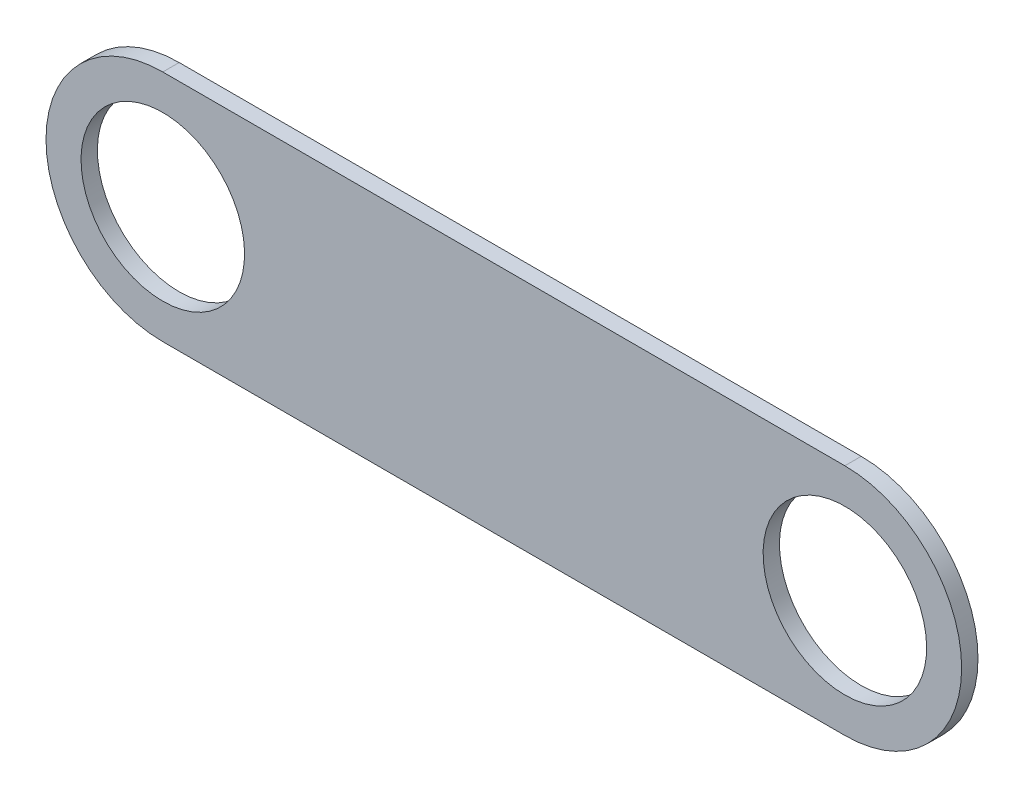
ISO-10303-21;
HEADER;
FILE_DESCRIPTION(('STEP AP214'),'2;1');
FILE_NAME('part.step','',(''),(''),'','','');
FILE_SCHEMA(('AUTOMOTIVE_DESIGN { 1 0 10303 214 1 1 1 1 }'));
ENDSEC;
DATA;
#1=APPLICATION_CONTEXT('core data for automotive mechanical design processes');
#2=APPLICATION_PROTOCOL_DEFINITION('international standard','automotive_design',2000,#1);
#3=PRODUCT_CONTEXT('',#1,'mechanical');
#4=PRODUCT('Part','Part','',(#3));
#5=PRODUCT_RELATED_PRODUCT_CATEGORY('part','',(#4));
#6=PRODUCT_DEFINITION_FORMATION('','',#4);
#7=PRODUCT_DEFINITION_CONTEXT('part definition',#1,'design');
#8=PRODUCT_DEFINITION('design','',#6,#7);
#9=PRODUCT_DEFINITION_SHAPE('','',#8);
#10=(LENGTH_UNIT() NAMED_UNIT(*) SI_UNIT(.MILLI.,.METRE.));
#11=(NAMED_UNIT(*) PLANE_ANGLE_UNIT() SI_UNIT($,.RADIAN.));
#12=(NAMED_UNIT(*) SI_UNIT($,.STERADIAN.) SOLID_ANGLE_UNIT());
#13=UNCERTAINTY_MEASURE_WITH_UNIT(LENGTH_MEASURE(1.E-05),#10,'distance_accuracy_value','');
#14=(GEOMETRIC_REPRESENTATION_CONTEXT(3) GLOBAL_UNCERTAINTY_ASSIGNED_CONTEXT((#13)) GLOBAL_UNIT_ASSIGNED_CONTEXT((#10,
#11,#12)) REPRESENTATION_CONTEXT('',''));
#15=CARTESIAN_POINT('',(0.,0.,0.));
#16=DIRECTION('',(0.,0.,1.));
#17=DIRECTION('',(1.,0.,0.));
#18=AXIS2_PLACEMENT_3D('',#15,#16,#17);
#19=CARTESIAN_POINT('',(117.72,-55.31,-0.045));
#20=DIRECTION('',(0.,0.,-1.));
#21=DIRECTION('',(0.,-1.,0.));
#22=AXIS2_PLACEMENT_3D('',#19,#20,#21);
#23=CYLINDRICAL_SURFACE('',#22,0.175);
#24=CARTESIAN_POINT('',(117.72,-55.31,-0.035));
#25=DIRECTION('',(0.,0.,-1.));
#26=DIRECTION('',(0.,-1.,0.));
#27=AXIS2_PLACEMENT_3D('',#24,#25,#26);
#28=CIRCLE('',#27,0.175);
#29=CARTESIAN_POINT('',(117.72,-55.485,-0.035));
#30=VERTEX_POINT('',#29);
#31=EDGE_CURVE('E145',#30,#30,#28,.T.);
#32=ORIENTED_EDGE('',*,*,#31,.T.);
#33=DIRECTION('',(0.,0.,1.));
#34=VECTOR('',#33,1.);
#35=CARTESIAN_POINT('',(117.72,-55.485,-0.045));
#36=LINE('',#35,#34);
#37=CARTESIAN_POINT('',(117.72,-55.485,0.));
#38=VERTEX_POINT('',#37);
#39=EDGE_CURVE('E11',#30,#38,#36,.T.);
#40=ORIENTED_EDGE('',*,*,#39,.T.);
#41=CARTESIAN_POINT('',(117.72,-55.31,0.));
#42=DIRECTION('',(0.,0.,-1.));
#43=DIRECTION('',(0.,-1.,0.));
#44=AXIS2_PLACEMENT_3D('',#41,#42,#43);
#45=CIRCLE('',#44,0.175);
#46=EDGE_CURVE('E152',#38,#38,#45,.T.);
#47=ORIENTED_EDGE('',*,*,#46,.F.);
#48=ORIENTED_EDGE('',*,*,#39,.F.);
#49=EDGE_LOOP('',(#32,#40,#47,#48));
#50=FACE_BOUND('',#49,.T.);
#51=ADVANCED_FACE('F17',(#50),#23,.F.);
#52=CARTESIAN_POINT('',(116.26,-55.31,-0.045));
#53=DIRECTION('',(0.,0.,-1.));
#54=DIRECTION('',(0.,-1.,0.));
#55=AXIS2_PLACEMENT_3D('',#52,#53,#54);
#56=CYLINDRICAL_SURFACE('',#55,0.175);
#57=CARTESIAN_POINT('',(116.26,-55.31,-0.035));
#58=DIRECTION('',(0.,0.,-1.));
#59=DIRECTION('',(0.,-1.,0.));
#60=AXIS2_PLACEMENT_3D('',#57,#58,#59);
#61=CIRCLE('',#60,0.175);
#62=CARTESIAN_POINT('',(116.26,-55.485,-0.035));
#63=VERTEX_POINT('',#62);
#64=EDGE_CURVE('E125',#63,#63,#61,.T.);
#65=ORIENTED_EDGE('',*,*,#64,.T.);
#66=DIRECTION('',(0.,0.,1.));
#67=VECTOR('',#66,1.);
#68=CARTESIAN_POINT('',(116.26,-55.485,-0.045));
#69=LINE('',#68,#67);
#70=CARTESIAN_POINT('',(116.26,-55.485,0.));
#71=VERTEX_POINT('',#70);
#72=EDGE_CURVE('E25',#63,#71,#69,.T.);
#73=ORIENTED_EDGE('',*,*,#72,.T.);
#74=CARTESIAN_POINT('',(116.26,-55.31,0.));
#75=DIRECTION('',(0.,0.,-1.));
#76=DIRECTION('',(0.,-1.,0.));
#77=AXIS2_PLACEMENT_3D('',#74,#75,#76);
#78=CIRCLE('',#77,0.175);
#79=EDGE_CURVE('E151',#71,#71,#78,.T.);
#80=ORIENTED_EDGE('',*,*,#79,.F.);
#81=ORIENTED_EDGE('',*,*,#72,.F.);
#82=EDGE_LOOP('',(#65,#73,#80,#81));
#83=FACE_BOUND('',#82,.T.);
#84=ADVANCED_FACE('F265',(#83),#56,.F.);
#85=CARTESIAN_POINT('',(116.26,-55.56,-0.035));
#86=DIRECTION('',(0.,1.,0.));
#87=DIRECTION('',(1.,0.,0.));
#88=AXIS2_PLACEMENT_3D('',#85,#86,#87);
#89=PLANE('',#88);
#90=DIRECTION('',(1.,0.,0.));
#91=VECTOR('',#90,1.);
#92=CARTESIAN_POINT('',(116.26,-55.56,-0.035));
#93=LINE('',#92,#91);
#94=CARTESIAN_POINT('',(116.26,-55.56,-0.035));
#95=VERTEX_POINT('',#94);
#96=CARTESIAN_POINT('',(117.72,-55.56,-0.035));
#97=VERTEX_POINT('',#96);
#98=EDGE_CURVE('E123',#95,#97,#93,.T.);
#99=ORIENTED_EDGE('',*,*,#98,.T.);
#100=DIRECTION('',(0.,0.,1.));
#101=VECTOR('',#100,1.);
#102=CARTESIAN_POINT('',(117.72,-55.56,-0.035));
#103=LINE('',#102,#101);
#104=CARTESIAN_POINT('',(117.72,-55.56,0.));
#105=VERTEX_POINT('',#104);
#106=EDGE_CURVE('E95',#97,#105,#103,.T.);
#107=ORIENTED_EDGE('',*,*,#106,.T.);
#108=DIRECTION('',(1.,0.,0.));
#109=VECTOR('',#108,1.);
#110=CARTESIAN_POINT('',(116.26,-55.56,0.));
#111=LINE('',#110,#109);
#112=CARTESIAN_POINT('',(116.26,-55.56,0.));
#113=VERTEX_POINT('',#112);
#114=EDGE_CURVE('E148',#113,#105,#111,.T.);
#115=ORIENTED_EDGE('',*,*,#114,.F.);
#116=DIRECTION('',(0.,0.,1.));
#117=VECTOR('',#116,1.);
#118=CARTESIAN_POINT('',(116.26,-55.56,-0.035));
#119=LINE('',#118,#117);
#120=EDGE_CURVE('E130',#95,#113,#119,.T.);
#121=ORIENTED_EDGE('',*,*,#120,.F.);
#122=EDGE_LOOP('',(#99,#107,#115,#121));
#123=FACE_BOUND('',#122,.T.);
#124=ADVANCED_FACE('F255',(#123),#89,.F.);
#125=CARTESIAN_POINT('',(117.72,-55.06,0.));
#126=DIRECTION('',(0.,0.,1.));
#127=DIRECTION('',(1.,0.,0.));
#128=AXIS2_PLACEMENT_3D('',#125,#126,#127);
#129=PLANE('',#128);
#130=ORIENTED_EDGE('',*,*,#46,.T.);
#131=EDGE_LOOP('',(#130));
#132=FACE_BOUND('',#131,.T.);
#133=ORIENTED_EDGE('',*,*,#79,.T.);
#134=EDGE_LOOP('',(#133));
#135=FACE_BOUND('',#134,.T.);
#136=DIRECTION('',(-1.,0.,0.));
#137=VECTOR('',#136,1.);
#138=CARTESIAN_POINT('',(117.72,-55.06,0.));
#139=LINE('',#138,#137);
#140=CARTESIAN_POINT('',(117.72,-55.06,0.));
#141=VERTEX_POINT('',#140);
#142=CARTESIAN_POINT('',(116.26,-55.06,0.));
#143=VERTEX_POINT('',#142);
#144=EDGE_CURVE('E107',#141,#143,#139,.T.);
#145=ORIENTED_EDGE('',*,*,#144,.T.);
#146=CARTESIAN_POINT('',(116.26,-55.31,0.));
#147=DIRECTION('',(0.,0.,1.));
#148=DIRECTION('',(0.,1.,0.));
#149=AXIS2_PLACEMENT_3D('',#146,#147,#148);
#150=CIRCLE('',#149,0.25);
#151=EDGE_CURVE('E126',#143,#113,#150,.T.);
#152=ORIENTED_EDGE('',*,*,#151,.T.);
#153=ORIENTED_EDGE('',*,*,#114,.T.);
#154=CARTESIAN_POINT('',(117.72,-55.31,0.));
#155=DIRECTION('',(0.,0.,1.));
#156=DIRECTION('',(0.,-1.,0.));
#157=AXIS2_PLACEMENT_3D('',#154,#155,#156);
#158=CIRCLE('',#157,0.25);
#159=EDGE_CURVE('E99',#105,#141,#158,.T.);
#160=ORIENTED_EDGE('',*,*,#159,.T.);
#161=EDGE_LOOP('',(#145,#152,#153,#160));
#162=FACE_BOUND('',#161,.T.);
#163=ADVANCED_FACE('F245',(#132,#135,#162),#129,.T.);
#164=CARTESIAN_POINT('',(117.72,-55.06,-0.035));
#165=DIRECTION('',(0.,0.,1.));
#166=DIRECTION('',(1.,0.,0.));
#167=AXIS2_PLACEMENT_3D('',#164,#165,#166);
#168=PLANE('',#167);
#169=ORIENTED_EDGE('',*,*,#31,.F.);
#170=EDGE_LOOP('',(#169));
#171=FACE_BOUND('',#170,.T.);
#172=ORIENTED_EDGE('',*,*,#64,.F.);
#173=EDGE_LOOP('',(#172));
#174=FACE_BOUND('',#173,.T.);
#175=CARTESIAN_POINT('',(117.72,-55.31,-0.035));
#176=DIRECTION('',(0.,0.,1.));
#177=DIRECTION('',(0.,-1.,0.));
#178=AXIS2_PLACEMENT_3D('',#175,#176,#177);
#179=CIRCLE('',#178,0.25);
#180=CARTESIAN_POINT('',(117.72,-55.06,-0.035));
#181=VERTEX_POINT('',#180);
#182=EDGE_CURVE('E88',#97,#181,#179,.T.);
#183=ORIENTED_EDGE('',*,*,#182,.F.);
#184=ORIENTED_EDGE('',*,*,#98,.F.);
#185=CARTESIAN_POINT('',(116.26,-55.31,-0.035));
#186=DIRECTION('',(0.,0.,1.));
#187=DIRECTION('',(0.,1.,0.));
#188=AXIS2_PLACEMENT_3D('',#185,#186,#187);
#189=CIRCLE('',#188,0.25);
#190=CARTESIAN_POINT('',(116.26,-55.06,-0.035));
#191=VERTEX_POINT('',#190);
#192=EDGE_CURVE('E112',#191,#95,#189,.T.);
#193=ORIENTED_EDGE('',*,*,#192,.F.);
#194=DIRECTION('',(-1.,0.,0.));
#195=VECTOR('',#194,1.);
#196=CARTESIAN_POINT('',(117.72,-55.06,-0.035));
#197=LINE('',#196,#195);
#198=EDGE_CURVE('E105',#181,#191,#197,.T.);
#199=ORIENTED_EDGE('',*,*,#198,.F.);
#200=EDGE_LOOP('',(#183,#184,#193,#199));
#201=FACE_BOUND('',#200,.T.);
#202=ADVANCED_FACE('F110',(#171,#174,#201),#168,.F.);
#203=CARTESIAN_POINT('',(116.26,-55.31,-0.035));
#204=DIRECTION('',(0.,0.,-1.));
#205=DIRECTION('',(0.,1.,0.));
#206=AXIS2_PLACEMENT_3D('',#203,#204,#205);
#207=CYLINDRICAL_SURFACE('',#206,0.25);
#208=ORIENTED_EDGE('',*,*,#192,.T.);
#209=ORIENTED_EDGE('',*,*,#120,.T.);
#210=ORIENTED_EDGE('',*,*,#151,.F.);
#211=DIRECTION('',(0.,0.,1.));
#212=VECTOR('',#211,1.);
#213=CARTESIAN_POINT('',(116.26,-55.06,-0.035));
#214=LINE('',#213,#212);
#215=EDGE_CURVE('E115',#191,#143,#214,.T.);
#216=ORIENTED_EDGE('',*,*,#215,.F.);
#217=EDGE_LOOP('',(#208,#209,#210,#216));
#218=FACE_BOUND('',#217,.T.);
#219=ADVANCED_FACE('F227',(#218),#207,.T.);
#220=CARTESIAN_POINT('',(117.72,-55.31,-0.035));
#221=DIRECTION('',(0.,0.,-1.));
#222=DIRECTION('',(0.,-1.,0.));
#223=AXIS2_PLACEMENT_3D('',#220,#221,#222);
#224=CYLINDRICAL_SURFACE('',#223,0.25);
#225=ORIENTED_EDGE('',*,*,#182,.T.);
#226=DIRECTION('',(0.,0.,1.));
#227=VECTOR('',#226,1.);
#228=CARTESIAN_POINT('',(117.72,-55.06,-0.035));
#229=LINE('',#228,#227);
#230=EDGE_CURVE('E92',#181,#141,#229,.T.);
#231=ORIENTED_EDGE('',*,*,#230,.T.);
#232=ORIENTED_EDGE('',*,*,#159,.F.);
#233=ORIENTED_EDGE('',*,*,#106,.F.);
#234=EDGE_LOOP('',(#225,#231,#232,#233));
#235=FACE_BOUND('',#234,.T.);
#236=ADVANCED_FACE('F90',(#235),#224,.T.);
#237=CARTESIAN_POINT('',(117.72,-55.06,-0.035));
#238=DIRECTION('',(0.,-1.,0.));
#239=DIRECTION('',(0.,0.,-1.));
#240=AXIS2_PLACEMENT_3D('',#237,#238,#239);
#241=PLANE('',#240);
#242=ORIENTED_EDGE('',*,*,#198,.T.);
#243=ORIENTED_EDGE('',*,*,#215,.T.);
#244=ORIENTED_EDGE('',*,*,#144,.F.);
#245=ORIENTED_EDGE('',*,*,#230,.F.);
#246=EDGE_LOOP('',(#242,#243,#244,#245));
#247=FACE_BOUND('',#246,.T.);
#248=ADVANCED_FACE('F103',(#247),#241,.F.);
#249=CLOSED_SHELL('',(#51,#84,#124,#163,#202,#219,#236,#248));
#250=MANIFOLD_SOLID_BREP('B1',#249);
#251=ADVANCED_BREP_SHAPE_REPRESENTATION('',(#18,#250),#14);
#252=SHAPE_DEFINITION_REPRESENTATION(#9,#251);
ENDSEC;
END-ISO-10303-21;
